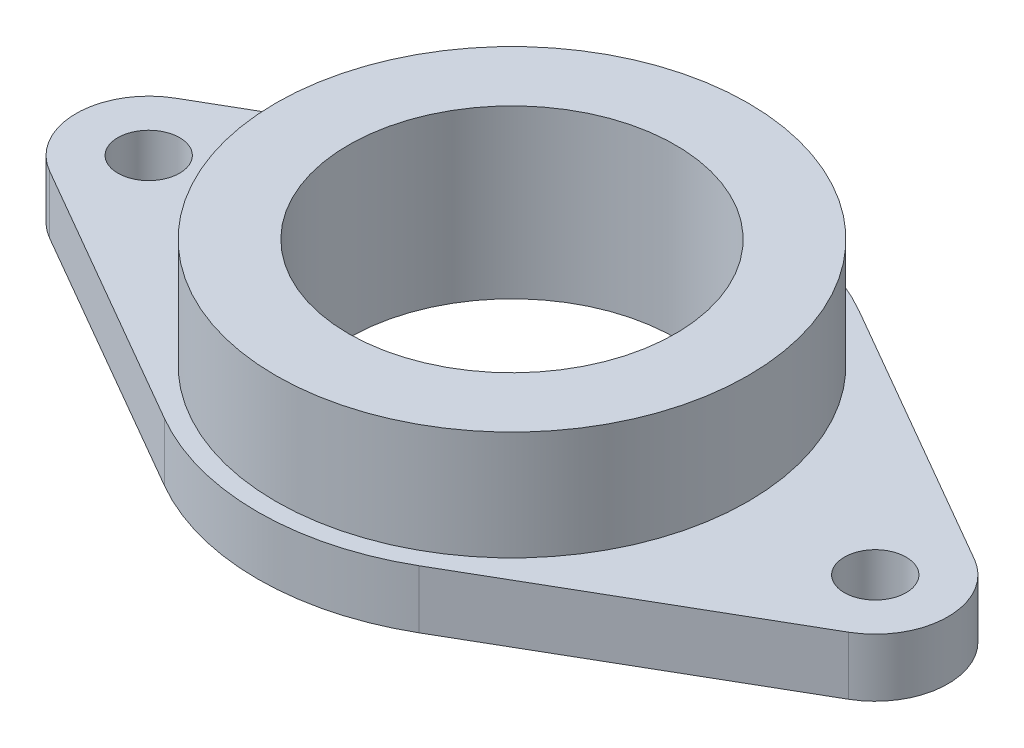
ISO-10303-21;
HEADER;
FILE_DESCRIPTION(('STEP AP214'),'2;1');
FILE_NAME('part.step','',(''),(''),'','','');
FILE_SCHEMA(('AUTOMOTIVE_DESIGN { 1 0 10303 214 1 1 1 1 }'));
ENDSEC;
DATA;
#1=APPLICATION_CONTEXT('core data for automotive mechanical design processes');
#2=APPLICATION_PROTOCOL_DEFINITION('international standard','automotive_design',2000,#1);
#3=PRODUCT_CONTEXT('',#1,'mechanical');
#4=PRODUCT('Part','Part','',(#3));
#5=PRODUCT_RELATED_PRODUCT_CATEGORY('part','',(#4));
#6=PRODUCT_DEFINITION_FORMATION('','',#4);
#7=PRODUCT_DEFINITION_CONTEXT('part definition',#1,'design');
#8=PRODUCT_DEFINITION('design','',#6,#7);
#9=PRODUCT_DEFINITION_SHAPE('','',#8);
#10=(LENGTH_UNIT() NAMED_UNIT(*) SI_UNIT(.MILLI.,.METRE.));
#11=(NAMED_UNIT(*) PLANE_ANGLE_UNIT() SI_UNIT($,.RADIAN.));
#12=(NAMED_UNIT(*) SI_UNIT($,.STERADIAN.) SOLID_ANGLE_UNIT());
#13=UNCERTAINTY_MEASURE_WITH_UNIT(LENGTH_MEASURE(1.E-05),#10,'distance_accuracy_value','');
#14=(GEOMETRIC_REPRESENTATION_CONTEXT(3) GLOBAL_UNCERTAINTY_ASSIGNED_CONTEXT((#13)) GLOBAL_UNIT_ASSIGNED_CONTEXT((#10,
#11,#12)) REPRESENTATION_CONTEXT('',''));
#15=CARTESIAN_POINT('',(0.,0.,0.));
#16=DIRECTION('',(0.,0.,1.));
#17=DIRECTION('',(1.,0.,0.));
#18=AXIS2_PLACEMENT_3D('',#15,#16,#17);
#19=CARTESIAN_POINT('',(-50.,23.,0.));
#20=DIRECTION('',(0.,1.,0.));
#21=DIRECTION('',(0.,0.,1.));
#22=AXIS2_PLACEMENT_3D('',#19,#20,#21);
#23=PLANE('',#22);
#24=CARTESIAN_POINT('',(0.,23.,0.));
#25=DIRECTION('',(0.,1.,0.));
#26=DIRECTION('',(0.,0.,1.));
#27=AXIS2_PLACEMENT_3D('',#24,#25,#26);
#28=CIRCLE('',#27,22.5);
#29=CARTESIAN_POINT('',(0.,23.,22.5));
#30=VERTEX_POINT('',#29);
#31=EDGE_CURVE('E195',#30,#30,#28,.T.);
#32=ORIENTED_EDGE('',*,*,#31,.F.);
#33=EDGE_LOOP('',(#32));
#34=FACE_BOUND('',#33,.T.);
#35=CARTESIAN_POINT('',(0.,23.,0.));
#36=DIRECTION('',(0.,1.,0.));
#37=DIRECTION('',(0.,0.,1.));
#38=AXIS2_PLACEMENT_3D('',#35,#36,#37);
#39=CIRCLE('',#38,32.5);
#40=CARTESIAN_POINT('',(0.,23.,32.5));
#41=VERTEX_POINT('',#40);
#42=EDGE_CURVE('E229',#41,#41,#39,.T.);
#43=ORIENTED_EDGE('',*,*,#42,.T.);
#44=EDGE_LOOP('',(#43));
#45=FACE_BOUND('',#44,.T.);
#46=ADVANCED_FACE('F44',(#34,#45),#23,.T.);
#47=CARTESIAN_POINT('',(-50.,23.,0.));
#48=DIRECTION('',(0.,-1.,0.));
#49=DIRECTION('',(0.,0.,-1.));
#50=AXIS2_PLACEMENT_3D('',#47,#48,#49);
#51=CYLINDRICAL_SURFACE('',#50,10.);
#52=CARTESIAN_POINT('',(-50.,8.,0.));
#53=DIRECTION('',(0.,1.,0.));
#54=DIRECTION('',(0.,0.,1.));
#55=AXIS2_PLACEMENT_3D('',#52,#53,#54);
#56=CIRCLE('',#55,10.);
#57=CARTESIAN_POINT('',(-55.,8.,-8.66025403784439));
#58=VERTEX_POINT('',#57);
#59=CARTESIAN_POINT('',(-55.,8.,8.66025403784439));
#60=VERTEX_POINT('',#59);
#61=EDGE_CURVE('E111',#58,#60,#56,.T.);
#62=ORIENTED_EDGE('',*,*,#61,.F.);
#63=DIRECTION('',(0.,-1.,0.));
#64=VECTOR('',#63,1.);
#65=CARTESIAN_POINT('',(-55.,23.,-8.66025403784439));
#66=LINE('',#65,#64);
#67=CARTESIAN_POINT('',(-55.,0.,-8.66025403784439));
#68=VERTEX_POINT('',#67);
#69=EDGE_CURVE('E69',#58,#68,#66,.T.);
#70=ORIENTED_EDGE('',*,*,#69,.T.);
#71=CARTESIAN_POINT('',(-50.,0.,0.));
#72=DIRECTION('',(0.,1.,0.));
#73=DIRECTION('',(0.,0.,1.));
#74=AXIS2_PLACEMENT_3D('',#71,#72,#73);
#75=CIRCLE('',#74,10.);
#76=CARTESIAN_POINT('',(-55.,0.,8.66025403784439));
#77=VERTEX_POINT('',#76);
#78=EDGE_CURVE('E167',#68,#77,#75,.T.);
#79=ORIENTED_EDGE('',*,*,#78,.T.);
#80=DIRECTION('',(0.,-1.,0.));
#81=VECTOR('',#80,1.);
#82=CARTESIAN_POINT('',(-55.,23.,8.66025403784439));
#83=LINE('',#82,#81);
#84=EDGE_CURVE('E12',#60,#77,#83,.T.);
#85=ORIENTED_EDGE('',*,*,#84,.F.);
#86=EDGE_LOOP('',(#62,#70,#79,#85));
#87=FACE_BOUND('',#86,.T.);
#88=ADVANCED_FACE('F46',(#87),#51,.T.);
#89=CARTESIAN_POINT('',(-55.,23.,8.66025403784439));
#90=DIRECTION('',(0.5,0.,-0.866025403784439));
#91=DIRECTION('',(-0.866025403784439,0.,-0.5));
#92=AXIS2_PLACEMENT_3D('',#89,#90,#91);
#93=PLANE('',#92);
#94=DIRECTION('',(0.866025403784439,0.,0.5));
#95=VECTOR('',#94,1.);
#96=CARTESIAN_POINT('',(-55.,8.,8.66025403784439));
#97=LINE('',#96,#95);
#98=CARTESIAN_POINT('',(-17.5,8.,30.3108891324554));
#99=VERTEX_POINT('',#98);
#100=EDGE_CURVE('E121',#60,#99,#97,.T.);
#101=ORIENTED_EDGE('',*,*,#100,.F.);
#102=ORIENTED_EDGE('',*,*,#84,.T.);
#103=DIRECTION('',(0.866025403784439,0.,0.5));
#104=VECTOR('',#103,1.);
#105=CARTESIAN_POINT('',(-55.,0.,8.66025403784439));
#106=LINE('',#105,#104);
#107=CARTESIAN_POINT('',(-17.5,0.,30.3108891324554));
#108=VERTEX_POINT('',#107);
#109=EDGE_CURVE('E163',#77,#108,#106,.T.);
#110=ORIENTED_EDGE('',*,*,#109,.T.);
#111=DIRECTION('',(0.,-1.,0.));
#112=VECTOR('',#111,1.);
#113=CARTESIAN_POINT('',(-17.5,23.,30.3108891324554));
#114=LINE('',#113,#112);
#115=EDGE_CURVE('E54',#99,#108,#114,.T.);
#116=ORIENTED_EDGE('',*,*,#115,.F.);
#117=EDGE_LOOP('',(#101,#102,#110,#116));
#118=FACE_BOUND('',#117,.T.);
#119=ADVANCED_FACE('F164',(#118),#93,.F.);
#120=CARTESIAN_POINT('',(0.,23.,0.));
#121=DIRECTION('',(0.,-1.,0.));
#122=DIRECTION('',(0.,0.,-1.));
#123=AXIS2_PLACEMENT_3D('',#120,#121,#122);
#124=CYLINDRICAL_SURFACE('',#123,35.);
#125=CARTESIAN_POINT('',(0.,8.,0.));
#126=DIRECTION('',(0.,1.,0.));
#127=DIRECTION('',(0.,0.,1.));
#128=AXIS2_PLACEMENT_3D('',#125,#126,#127);
#129=CIRCLE('',#128,35.);
#130=CARTESIAN_POINT('',(17.5,8.,30.3108891324554));
#131=VERTEX_POINT('',#130);
#132=EDGE_CURVE('E160',#99,#131,#129,.T.);
#133=ORIENTED_EDGE('',*,*,#132,.F.);
#134=ORIENTED_EDGE('',*,*,#115,.T.);
#135=CARTESIAN_POINT('',(0.,0.,0.));
#136=DIRECTION('',(0.,1.,0.));
#137=DIRECTION('',(0.,0.,1.));
#138=AXIS2_PLACEMENT_3D('',#135,#136,#137);
#139=CIRCLE('',#138,35.);
#140=CARTESIAN_POINT('',(17.5,0.,30.3108891324554));
#141=VERTEX_POINT('',#140);
#142=EDGE_CURVE('E158',#108,#141,#139,.T.);
#143=ORIENTED_EDGE('',*,*,#142,.T.);
#144=DIRECTION('',(0.,-1.,0.));
#145=VECTOR('',#144,1.);
#146=CARTESIAN_POINT('',(17.5,23.,30.3108891324554));
#147=LINE('',#146,#145);
#148=EDGE_CURVE('E146',#131,#141,#147,.T.);
#149=ORIENTED_EDGE('',*,*,#148,.F.);
#150=EDGE_LOOP('',(#133,#134,#143,#149));
#151=FACE_BOUND('',#150,.T.);
#152=ADVANCED_FACE('F155',(#151),#124,.T.);
#153=CARTESIAN_POINT('',(55.,23.,8.66025403784439));
#154=DIRECTION('',(-0.5,0.,-0.866025403784439));
#155=DIRECTION('',(-0.866025403784439,0.,0.5));
#156=AXIS2_PLACEMENT_3D('',#153,#154,#155);
#157=PLANE('',#156);
#158=DIRECTION('',(0.866025403784439,0.,-0.5));
#159=VECTOR('',#158,1.);
#160=CARTESIAN_POINT('',(55.,8.,8.66025403784439));
#161=LINE('',#160,#159);
#162=CARTESIAN_POINT('',(55.,8.,8.66025403784439));
#163=VERTEX_POINT('',#162);
#164=EDGE_CURVE('E215',#131,#163,#161,.T.);
#165=ORIENTED_EDGE('',*,*,#164,.F.);
#166=ORIENTED_EDGE('',*,*,#148,.T.);
#167=DIRECTION('',(0.866025403784439,0.,-0.5));
#168=VECTOR('',#167,1.);
#169=CARTESIAN_POINT('',(55.,0.,8.66025403784439));
#170=LINE('',#169,#168);
#171=CARTESIAN_POINT('',(55.,0.,8.66025403784439));
#172=VERTEX_POINT('',#171);
#173=EDGE_CURVE('E173',#141,#172,#170,.T.);
#174=ORIENTED_EDGE('',*,*,#173,.T.);
#175=DIRECTION('',(0.,-1.,0.));
#176=VECTOR('',#175,1.);
#177=CARTESIAN_POINT('',(55.,23.,8.66025403784439));
#178=LINE('',#177,#176);
#179=EDGE_CURVE('E143',#163,#172,#178,.T.);
#180=ORIENTED_EDGE('',*,*,#179,.F.);
#181=EDGE_LOOP('',(#165,#166,#174,#180));
#182=FACE_BOUND('',#181,.T.);
#183=ADVANCED_FACE('F285',(#182),#157,.F.);
#184=CARTESIAN_POINT('',(50.,23.,0.));
#185=DIRECTION('',(0.,-1.,0.));
#186=DIRECTION('',(0.,0.,-1.));
#187=AXIS2_PLACEMENT_3D('',#184,#185,#186);
#188=CYLINDRICAL_SURFACE('',#187,10.);
#189=CARTESIAN_POINT('',(50.,8.,0.));
#190=DIRECTION('',(0.,1.,0.));
#191=DIRECTION('',(0.,0.,1.));
#192=AXIS2_PLACEMENT_3D('',#189,#190,#191);
#193=CIRCLE('',#192,10.);
#194=CARTESIAN_POINT('',(55.,8.,-8.66025403784439));
#195=VERTEX_POINT('',#194);
#196=EDGE_CURVE('E218',#163,#195,#193,.T.);
#197=ORIENTED_EDGE('',*,*,#196,.F.);
#198=ORIENTED_EDGE('',*,*,#179,.T.);
#199=CARTESIAN_POINT('',(50.,0.,0.));
#200=DIRECTION('',(0.,1.,0.));
#201=DIRECTION('',(0.,0.,-1.));
#202=AXIS2_PLACEMENT_3D('',#199,#200,#201);
#203=CIRCLE('',#202,10.);
#204=CARTESIAN_POINT('',(55.,0.,-8.66025403784439));
#205=VERTEX_POINT('',#204);
#206=EDGE_CURVE('E177',#172,#205,#203,.T.);
#207=ORIENTED_EDGE('',*,*,#206,.T.);
#208=DIRECTION('',(0.,-1.,0.));
#209=VECTOR('',#208,1.);
#210=CARTESIAN_POINT('',(55.,23.,-8.66025403784439));
#211=LINE('',#210,#209);
#212=EDGE_CURVE('E140',#195,#205,#211,.T.);
#213=ORIENTED_EDGE('',*,*,#212,.F.);
#214=EDGE_LOOP('',(#197,#198,#207,#213));
#215=FACE_BOUND('',#214,.T.);
#216=ADVANCED_FACE('F281',(#215),#188,.T.);
#217=CARTESIAN_POINT('',(55.,23.,-8.66025403784439));
#218=DIRECTION('',(-0.5,0.,0.866025403784439));
#219=DIRECTION('',(0.866025403784439,0.,0.5));
#220=AXIS2_PLACEMENT_3D('',#217,#218,#219);
#221=PLANE('',#220);
#222=DIRECTION('',(-0.866025403784439,0.,-0.5));
#223=VECTOR('',#222,1.);
#224=CARTESIAN_POINT('',(55.,8.,-8.66025403784439));
#225=LINE('',#224,#223);
#226=CARTESIAN_POINT('',(17.5,8.,-30.3108891324554));
#227=VERTEX_POINT('',#226);
#228=EDGE_CURVE('E221',#195,#227,#225,.T.);
#229=ORIENTED_EDGE('',*,*,#228,.F.);
#230=ORIENTED_EDGE('',*,*,#212,.T.);
#231=DIRECTION('',(-0.866025403784439,0.,-0.5));
#232=VECTOR('',#231,1.);
#233=CARTESIAN_POINT('',(55.,0.,-8.66025403784439));
#234=LINE('',#233,#232);
#235=CARTESIAN_POINT('',(17.5,0.,-30.3108891324554));
#236=VERTEX_POINT('',#235);
#237=EDGE_CURVE('E184',#205,#236,#234,.T.);
#238=ORIENTED_EDGE('',*,*,#237,.T.);
#239=DIRECTION('',(0.,-1.,0.));
#240=VECTOR('',#239,1.);
#241=CARTESIAN_POINT('',(17.5,23.,-30.3108891324554));
#242=LINE('',#241,#240);
#243=EDGE_CURVE('E132',#227,#236,#242,.T.);
#244=ORIENTED_EDGE('',*,*,#243,.F.);
#245=EDGE_LOOP('',(#229,#230,#238,#244));
#246=FACE_BOUND('',#245,.T.);
#247=ADVANCED_FACE('F278',(#246),#221,.F.);
#248=CARTESIAN_POINT('',(0.,23.,0.));
#249=DIRECTION('',(0.,-1.,0.));
#250=DIRECTION('',(0.,0.,-1.));
#251=AXIS2_PLACEMENT_3D('',#248,#249,#250);
#252=CYLINDRICAL_SURFACE('',#251,35.);
#253=CARTESIAN_POINT('',(0.,8.,0.));
#254=DIRECTION('',(0.,1.,0.));
#255=DIRECTION('',(0.,0.,1.));
#256=AXIS2_PLACEMENT_3D('',#253,#254,#255);
#257=CIRCLE('',#256,35.);
#258=CARTESIAN_POINT('',(-17.5,8.,-30.3108891324554));
#259=VERTEX_POINT('',#258);
#260=EDGE_CURVE('E61',#227,#259,#257,.T.);
#261=ORIENTED_EDGE('',*,*,#260,.F.);
#262=ORIENTED_EDGE('',*,*,#243,.T.);
#263=CARTESIAN_POINT('',(0.,0.,0.));
#264=DIRECTION('',(0.,1.,0.));
#265=DIRECTION('',(0.,0.,1.));
#266=AXIS2_PLACEMENT_3D('',#263,#264,#265);
#267=CIRCLE('',#266,35.);
#268=CARTESIAN_POINT('',(-17.5,0.,-30.3108891324554));
#269=VERTEX_POINT('',#268);
#270=EDGE_CURVE('E134',#236,#269,#267,.T.);
#271=ORIENTED_EDGE('',*,*,#270,.T.);
#272=DIRECTION('',(0.,-1.,0.));
#273=VECTOR('',#272,1.);
#274=CARTESIAN_POINT('',(-17.5,23.,-30.3108891324554));
#275=LINE('',#274,#273);
#276=EDGE_CURVE('E128',#259,#269,#275,.T.);
#277=ORIENTED_EDGE('',*,*,#276,.F.);
#278=EDGE_LOOP('',(#261,#262,#271,#277));
#279=FACE_BOUND('',#278,.T.);
#280=ADVANCED_FACE('F191',(#279),#252,.T.);
#281=CARTESIAN_POINT('',(-55.,23.,-8.66025403784439));
#282=DIRECTION('',(0.5,0.,0.866025403784439));
#283=DIRECTION('',(0.866025403784439,0.,-0.5));
#284=AXIS2_PLACEMENT_3D('',#281,#282,#283);
#285=PLANE('',#284);
#286=DIRECTION('',(-0.866025403784439,0.,0.5));
#287=VECTOR('',#286,1.);
#288=CARTESIAN_POINT('',(-55.,8.,-8.66025403784439));
#289=LINE('',#288,#287);
#290=EDGE_CURVE('E109',#259,#58,#289,.T.);
#291=ORIENTED_EDGE('',*,*,#290,.F.);
#292=ORIENTED_EDGE('',*,*,#276,.T.);
#293=DIRECTION('',(-0.866025403784439,0.,0.5));
#294=VECTOR('',#293,1.);
#295=CARTESIAN_POINT('',(-55.,0.,-8.66025403784439));
#296=LINE('',#295,#294);
#297=EDGE_CURVE('E125',#269,#68,#296,.T.);
#298=ORIENTED_EDGE('',*,*,#297,.T.);
#299=ORIENTED_EDGE('',*,*,#69,.F.);
#300=EDGE_LOOP('',(#291,#292,#298,#299));
#301=FACE_BOUND('',#300,.T.);
#302=ADVANCED_FACE('F123',(#301),#285,.F.);
#303=CARTESIAN_POINT('',(-50.,23.,0.));
#304=DIRECTION('',(0.,-1.,0.));
#305=DIRECTION('',(0.,0.,-1.));
#306=AXIS2_PLACEMENT_3D('',#303,#304,#305);
#307=CYLINDRICAL_SURFACE('',#306,4.25000000000001);
#308=CARTESIAN_POINT('',(-50.,0.,0.));
#309=DIRECTION('',(0.,1.,0.));
#310=DIRECTION('',(0.,0.,1.));
#311=AXIS2_PLACEMENT_3D('',#308,#309,#310);
#312=CIRCLE('',#311,4.25000000000001);
#313=CARTESIAN_POINT('',(-50.,0.,4.25000000000001));
#314=VERTEX_POINT('',#313);
#315=EDGE_CURVE('E203',#314,#314,#312,.T.);
#316=ORIENTED_EDGE('',*,*,#315,.F.);
#317=EDGE_LOOP('',(#316));
#318=FACE_BOUND('',#317,.T.);
#319=CARTESIAN_POINT('',(-50.,8.,0.));
#320=DIRECTION('',(0.,1.,0.));
#321=DIRECTION('',(0.,0.,1.));
#322=AXIS2_PLACEMENT_3D('',#319,#320,#321);
#323=CIRCLE('',#322,4.25000000000001);
#324=CARTESIAN_POINT('',(-50.,8.,4.25000000000001));
#325=VERTEX_POINT('',#324);
#326=EDGE_CURVE('E116',#325,#325,#323,.T.);
#327=ORIENTED_EDGE('',*,*,#326,.T.);
#328=EDGE_LOOP('',(#327));
#329=FACE_BOUND('',#328,.T.);
#330=ADVANCED_FACE('F252',(#318,#329),#307,.F.);
#331=CARTESIAN_POINT('',(50.,23.,0.));
#332=DIRECTION('',(0.,-1.,0.));
#333=DIRECTION('',(0.,0.,-1.));
#334=AXIS2_PLACEMENT_3D('',#331,#332,#333);
#335=CYLINDRICAL_SURFACE('',#334,4.25000000000001);
#336=CARTESIAN_POINT('',(50.,0.,0.));
#337=DIRECTION('',(0.,1.,0.));
#338=DIRECTION('',(0.,0.,-1.));
#339=AXIS2_PLACEMENT_3D('',#336,#337,#338);
#340=CIRCLE('',#339,4.25000000000001);
#341=CARTESIAN_POINT('',(50.,0.,-4.25000000000001));
#342=VERTEX_POINT('',#341);
#343=EDGE_CURVE('E120',#342,#342,#340,.T.);
#344=ORIENTED_EDGE('',*,*,#343,.F.);
#345=EDGE_LOOP('',(#344));
#346=FACE_BOUND('',#345,.T.);
#347=CARTESIAN_POINT('',(50.,8.,0.));
#348=DIRECTION('',(0.,1.,0.));
#349=DIRECTION('',(0.,0.,1.));
#350=AXIS2_PLACEMENT_3D('',#347,#348,#349);
#351=CIRCLE('',#350,4.25000000000001);
#352=CARTESIAN_POINT('',(50.,8.,4.25000000000001));
#353=VERTEX_POINT('',#352);
#354=EDGE_CURVE('E48',#353,#353,#351,.T.);
#355=ORIENTED_EDGE('',*,*,#354,.T.);
#356=EDGE_LOOP('',(#355));
#357=FACE_BOUND('',#356,.T.);
#358=ADVANCED_FACE('F242',(#346,#357),#335,.F.);
#359=CARTESIAN_POINT('',(-50.,0.,0.));
#360=DIRECTION('',(0.,1.,0.));
#361=DIRECTION('',(0.,0.,1.));
#362=AXIS2_PLACEMENT_3D('',#359,#360,#361);
#363=PLANE('',#362);
#364=ORIENTED_EDGE('',*,*,#78,.F.);
#365=ORIENTED_EDGE('',*,*,#297,.F.);
#366=ORIENTED_EDGE('',*,*,#270,.F.);
#367=ORIENTED_EDGE('',*,*,#237,.F.);
#368=ORIENTED_EDGE('',*,*,#206,.F.);
#369=ORIENTED_EDGE('',*,*,#173,.F.);
#370=ORIENTED_EDGE('',*,*,#142,.F.);
#371=ORIENTED_EDGE('',*,*,#109,.F.);
#372=EDGE_LOOP('',(#364,#365,#366,#367,#368,#369,#370,#371));
#373=FACE_BOUND('',#372,.T.);
#374=CARTESIAN_POINT('',(0.,0.,0.));
#375=DIRECTION('',(0.,1.,0.));
#376=DIRECTION('',(0.,0.,1.));
#377=AXIS2_PLACEMENT_3D('',#374,#375,#376);
#378=CIRCLE('',#377,22.5);
#379=CARTESIAN_POINT('',(0.,0.,22.5));
#380=VERTEX_POINT('',#379);
#381=EDGE_CURVE('E198',#380,#380,#378,.T.);
#382=ORIENTED_EDGE('',*,*,#381,.T.);
#383=EDGE_LOOP('',(#382));
#384=FACE_BOUND('',#383,.T.);
#385=ORIENTED_EDGE('',*,*,#315,.T.);
#386=EDGE_LOOP('',(#385));
#387=FACE_BOUND('',#386,.T.);
#388=ORIENTED_EDGE('',*,*,#343,.T.);
#389=EDGE_LOOP('',(#388));
#390=FACE_BOUND('',#389,.T.);
#391=ADVANCED_FACE('F169',(#373,#384,#387,#390),#363,.F.);
#392=CARTESIAN_POINT('',(0.,23.,0.));
#393=DIRECTION('',(0.,-1.,0.));
#394=DIRECTION('',(0.,0.,-1.));
#395=AXIS2_PLACEMENT_3D('',#392,#393,#394);
#396=CYLINDRICAL_SURFACE('',#395,22.5);
#397=ORIENTED_EDGE('',*,*,#31,.T.);
#398=EDGE_LOOP('',(#397));
#399=FACE_BOUND('',#398,.T.);
#400=ORIENTED_EDGE('',*,*,#381,.F.);
#401=EDGE_LOOP('',(#400));
#402=FACE_BOUND('',#401,.T.);
#403=ADVANCED_FACE('F247',(#399,#402),#396,.F.);
#404=CARTESIAN_POINT('',(0.,8.,0.));
#405=DIRECTION('',(0.,1.,0.));
#406=DIRECTION('',(0.,0.,1.));
#407=AXIS2_PLACEMENT_3D('',#404,#405,#406);
#408=PLANE('',#407);
#409=CARTESIAN_POINT('',(0.,8.,0.));
#410=DIRECTION('',(0.,1.,0.));
#411=DIRECTION('',(0.,0.,1.));
#412=AXIS2_PLACEMENT_3D('',#409,#410,#411);
#413=CIRCLE('',#412,32.5);
#414=CARTESIAN_POINT('',(0.,8.,32.5));
#415=VERTEX_POINT('',#414);
#416=EDGE_CURVE('E233',#415,#415,#413,.T.);
#417=ORIENTED_EDGE('',*,*,#416,.F.);
#418=EDGE_LOOP('',(#417));
#419=FACE_BOUND('',#418,.T.);
#420=ORIENTED_EDGE('',*,*,#354,.F.);
#421=EDGE_LOOP('',(#420));
#422=FACE_BOUND('',#421,.T.);
#423=ORIENTED_EDGE('',*,*,#326,.F.);
#424=EDGE_LOOP('',(#423));
#425=FACE_BOUND('',#424,.T.);
#426=ORIENTED_EDGE('',*,*,#61,.T.);
#427=ORIENTED_EDGE('',*,*,#100,.T.);
#428=ORIENTED_EDGE('',*,*,#132,.T.);
#429=ORIENTED_EDGE('',*,*,#164,.T.);
#430=ORIENTED_EDGE('',*,*,#196,.T.);
#431=ORIENTED_EDGE('',*,*,#228,.T.);
#432=ORIENTED_EDGE('',*,*,#260,.T.);
#433=ORIENTED_EDGE('',*,*,#290,.T.);
#434=EDGE_LOOP('',(#426,#427,#428,#429,#430,#431,#432,#433));
#435=FACE_BOUND('',#434,.T.);
#436=ADVANCED_FACE('F110',(#419,#422,#425,#435),#408,.T.);
#437=CARTESIAN_POINT('',(0.,8.,0.));
#438=DIRECTION('',(0.,1.,0.));
#439=DIRECTION('',(0.,0.,1.));
#440=AXIS2_PLACEMENT_3D('',#437,#438,#439);
#441=CYLINDRICAL_SURFACE('',#440,32.5);
#442=ORIENTED_EDGE('',*,*,#416,.T.);
#443=EDGE_LOOP('',(#442));
#444=FACE_BOUND('',#443,.T.);
#445=ORIENTED_EDGE('',*,*,#42,.F.);
#446=EDGE_LOOP('',(#445));
#447=FACE_BOUND('',#446,.T.);
#448=ADVANCED_FACE('F246',(#444,#447),#441,.T.);
#449=CLOSED_SHELL('',(#46,#88,#119,#152,#183,#216,#247,#280,#302,#330,#358,#391,#403,#436,#448));
#450=MANIFOLD_SOLID_BREP('B2',#449);
#451=ADVANCED_BREP_SHAPE_REPRESENTATION('',(#18,#450),#14);
#452=SHAPE_DEFINITION_REPRESENTATION(#9,#451);
ENDSEC;
END-ISO-10303-21;
